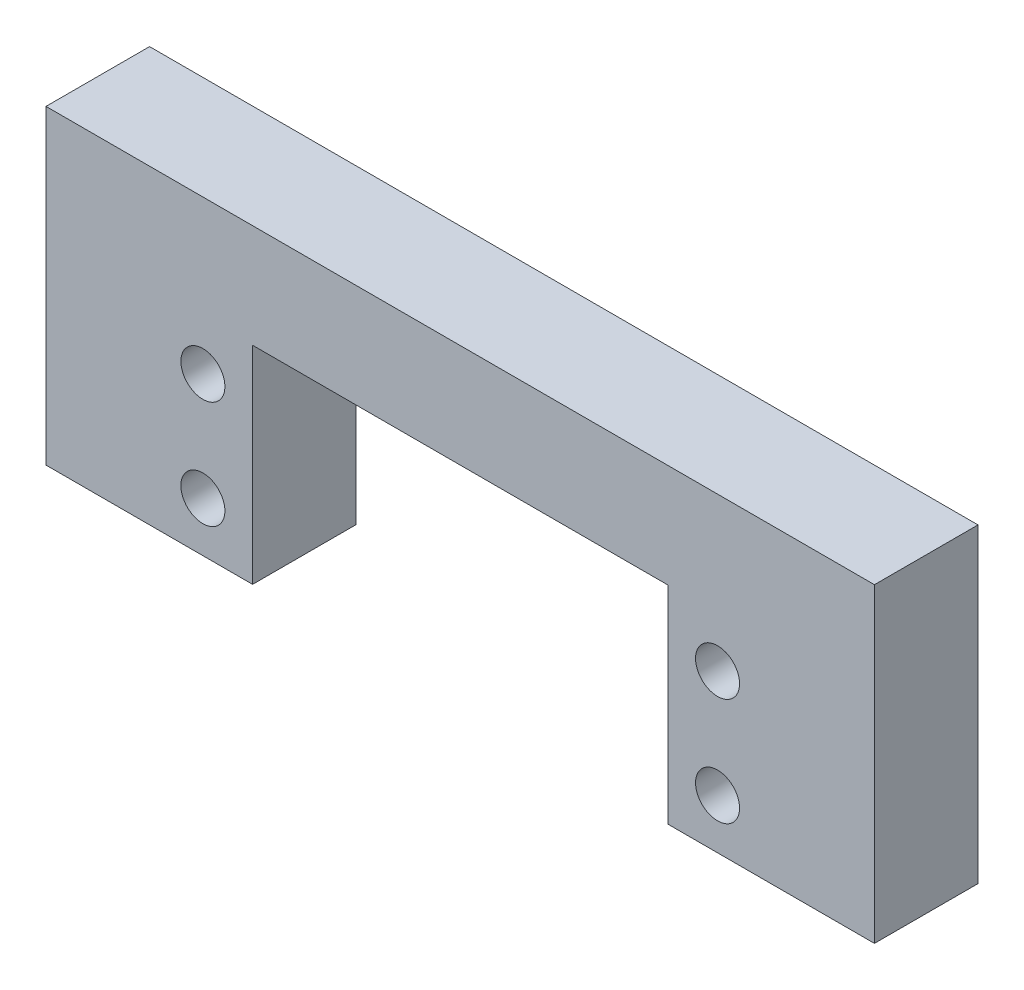
ISO-10303-21;
HEADER;
FILE_DESCRIPTION(('STEP AP214'),'2;1');
FILE_NAME('part.step','',(''),(''),'','','');
FILE_SCHEMA(('AUTOMOTIVE_DESIGN { 1 0 10303 214 1 1 1 1 }'));
ENDSEC;
DATA;
#1=APPLICATION_CONTEXT('core data for automotive mechanical design processes');
#2=APPLICATION_PROTOCOL_DEFINITION('international standard','automotive_design',2000,#1);
#3=PRODUCT_CONTEXT('',#1,'mechanical');
#4=PRODUCT('Part','Part','',(#3));
#5=PRODUCT_RELATED_PRODUCT_CATEGORY('part','',(#4));
#6=PRODUCT_DEFINITION_FORMATION('','',#4);
#7=PRODUCT_DEFINITION_CONTEXT('part definition',#1,'design');
#8=PRODUCT_DEFINITION('design','',#6,#7);
#9=PRODUCT_DEFINITION_SHAPE('','',#8);
#10=(LENGTH_UNIT() NAMED_UNIT(*) SI_UNIT(.MILLI.,.METRE.));
#11=(NAMED_UNIT(*) PLANE_ANGLE_UNIT() SI_UNIT($,.RADIAN.));
#12=(NAMED_UNIT(*) SI_UNIT($,.STERADIAN.) SOLID_ANGLE_UNIT());
#13=UNCERTAINTY_MEASURE_WITH_UNIT(LENGTH_MEASURE(1.E-05),#10,'distance_accuracy_value','');
#14=(GEOMETRIC_REPRESENTATION_CONTEXT(3) GLOBAL_UNCERTAINTY_ASSIGNED_CONTEXT((#13)) GLOBAL_UNIT_ASSIGNED_CONTEXT((#10,
#11,#12)) REPRESENTATION_CONTEXT('',''));
#15=CARTESIAN_POINT('',(0.,0.,0.));
#16=DIRECTION('',(0.,0.,1.));
#17=DIRECTION('',(1.,0.,0.));
#18=AXIS2_PLACEMENT_3D('',#15,#16,#17);
#19=CARTESIAN_POINT('',(0.,0.,10.));
#20=DIRECTION('',(1.,0.,0.));
#21=DIRECTION('',(0.,0.,-1.));
#22=AXIS2_PLACEMENT_3D('',#19,#20,#21);
#23=PLANE('',#22);
#24=DIRECTION('',(0.,-1.,0.));
#25=VECTOR('',#24,1.);
#26=CARTESIAN_POINT('',(0.,0.,0.));
#27=LINE('',#26,#25);
#28=CARTESIAN_POINT('',(0.,30.,0.));
#29=VERTEX_POINT('',#28);
#30=CARTESIAN_POINT('',(0.,0.,0.));
#31=VERTEX_POINT('',#30);
#32=EDGE_CURVE('E129',#29,#31,#27,.T.);
#33=ORIENTED_EDGE('',*,*,#32,.T.);
#34=DIRECTION('',(0.,0.,-1.));
#35=VECTOR('',#34,1.);
#36=CARTESIAN_POINT('',(0.,0.,10.));
#37=LINE('',#36,#35);
#38=CARTESIAN_POINT('',(0.,0.,10.));
#39=VERTEX_POINT('',#38);
#40=EDGE_CURVE('E11',#39,#31,#37,.T.);
#41=ORIENTED_EDGE('',*,*,#40,.F.);
#42=DIRECTION('',(0.,-1.,0.));
#43=VECTOR('',#42,1.);
#44=CARTESIAN_POINT('',(0.,0.,10.));
#45=LINE('',#44,#43);
#46=CARTESIAN_POINT('',(0.,30.,10.));
#47=VERTEX_POINT('',#46);
#48=EDGE_CURVE('E144',#47,#39,#45,.T.);
#49=ORIENTED_EDGE('',*,*,#48,.F.);
#50=DIRECTION('',(0.,0.,-1.));
#51=VECTOR('',#50,1.);
#52=CARTESIAN_POINT('',(0.,30.,10.));
#53=LINE('',#52,#51);
#54=EDGE_CURVE('E125',#47,#29,#53,.T.);
#55=ORIENTED_EDGE('',*,*,#54,.T.);
#56=EDGE_LOOP('',(#33,#41,#49,#55));
#57=FACE_BOUND('',#56,.T.);
#58=ADVANCED_FACE('F33',(#57),#23,.F.);
#59=CARTESIAN_POINT('',(0.,0.,10.));
#60=DIRECTION('',(0.,1.,0.));
#61=DIRECTION('',(0.,0.,1.));
#62=AXIS2_PLACEMENT_3D('',#59,#60,#61);
#63=PLANE('',#62);
#64=CARTESIAN_POINT('',(5.,0.,5.));
#65=DIRECTION('',(0.,-1.,0.));
#66=DIRECTION('',(0.,0.,-1.));
#67=AXIS2_PLACEMENT_3D('',#64,#65,#66);
#68=CIRCLE('',#67,2.);
#69=CARTESIAN_POINT('',(5.,0.,3.));
#70=VERTEX_POINT('',#69);
#71=EDGE_CURVE('E177',#70,#70,#68,.T.);
#72=ORIENTED_EDGE('',*,*,#71,.F.);
#73=EDGE_LOOP('',(#72));
#74=FACE_BOUND('',#73,.T.);
#75=DIRECTION('',(1.,0.,0.));
#76=VECTOR('',#75,1.);
#77=CARTESIAN_POINT('',(0.,0.,0.));
#78=LINE('',#77,#76);
#79=CARTESIAN_POINT('',(19.95,0.,0.));
#80=VERTEX_POINT('',#79);
#81=EDGE_CURVE('E132',#31,#80,#78,.T.);
#82=ORIENTED_EDGE('',*,*,#81,.T.);
#83=DIRECTION('',(0.,0.,-1.));
#84=VECTOR('',#83,1.);
#85=CARTESIAN_POINT('',(19.95,0.,10.));
#86=LINE('',#85,#84);
#87=CARTESIAN_POINT('',(19.95,0.,10.));
#88=VERTEX_POINT('',#87);
#89=EDGE_CURVE('E41',#88,#80,#86,.T.);
#90=ORIENTED_EDGE('',*,*,#89,.F.);
#91=DIRECTION('',(1.,0.,0.));
#92=VECTOR('',#91,1.);
#93=CARTESIAN_POINT('',(0.,0.,10.));
#94=LINE('',#93,#92);
#95=EDGE_CURVE('E92',#39,#88,#94,.T.);
#96=ORIENTED_EDGE('',*,*,#95,.F.);
#97=ORIENTED_EDGE('',*,*,#40,.T.);
#98=EDGE_LOOP('',(#82,#90,#96,#97));
#99=FACE_BOUND('',#98,.T.);
#100=ADVANCED_FACE('F249',(#74,#99),#63,.F.);
#101=CARTESIAN_POINT('',(19.95,0.,10.));
#102=DIRECTION('',(-1.,0.,0.));
#103=DIRECTION('',(0.,0.,1.));
#104=AXIS2_PLACEMENT_3D('',#101,#102,#103);
#105=PLANE('',#104);
#106=DIRECTION('',(0.,1.,0.));
#107=VECTOR('',#106,1.);
#108=CARTESIAN_POINT('',(19.95,0.,0.));
#109=LINE('',#108,#107);
#110=CARTESIAN_POINT('',(19.95,20.,0.));
#111=VERTEX_POINT('',#110);
#112=EDGE_CURVE('E135',#80,#111,#109,.T.);
#113=ORIENTED_EDGE('',*,*,#112,.T.);
#114=DIRECTION('',(0.,0.,-1.));
#115=VECTOR('',#114,1.);
#116=CARTESIAN_POINT('',(19.95,20.,10.));
#117=LINE('',#116,#115);
#118=CARTESIAN_POINT('',(19.95,20.,10.));
#119=VERTEX_POINT('',#118);
#120=EDGE_CURVE('E151',#119,#111,#117,.T.);
#121=ORIENTED_EDGE('',*,*,#120,.F.);
#122=DIRECTION('',(0.,1.,0.));
#123=VECTOR('',#122,1.);
#124=CARTESIAN_POINT('',(19.95,0.,10.));
#125=LINE('',#124,#123);
#126=EDGE_CURVE('E159',#88,#119,#125,.T.);
#127=ORIENTED_EDGE('',*,*,#126,.F.);
#128=ORIENTED_EDGE('',*,*,#89,.T.);
#129=EDGE_LOOP('',(#113,#121,#127,#128));
#130=FACE_BOUND('',#129,.T.);
#131=ADVANCED_FACE('F157',(#130),#105,.F.);
#132=CARTESIAN_POINT('',(19.95,20.,10.));
#133=DIRECTION('',(0.,1.,0.));
#134=DIRECTION('',(0.,0.,1.));
#135=AXIS2_PLACEMENT_3D('',#132,#133,#134);
#136=PLANE('',#135);
#137=DIRECTION('',(1.,0.,0.));
#138=VECTOR('',#137,1.);
#139=CARTESIAN_POINT('',(19.95,20.,0.));
#140=LINE('',#139,#138);
#141=CARTESIAN_POINT('',(60.05,20.,0.));
#142=VERTEX_POINT('',#141);
#143=EDGE_CURVE('E137',#111,#142,#140,.T.);
#144=ORIENTED_EDGE('',*,*,#143,.T.);
#145=DIRECTION('',(0.,0.,-1.));
#146=VECTOR('',#145,1.);
#147=CARTESIAN_POINT('',(60.05,20.,10.));
#148=LINE('',#147,#146);
#149=CARTESIAN_POINT('',(60.05,20.,10.));
#150=VERTEX_POINT('',#149);
#151=EDGE_CURVE('E148',#150,#142,#148,.T.);
#152=ORIENTED_EDGE('',*,*,#151,.F.);
#153=DIRECTION('',(1.,0.,0.));
#154=VECTOR('',#153,1.);
#155=CARTESIAN_POINT('',(19.95,20.,10.));
#156=LINE('',#155,#154);
#157=EDGE_CURVE('E171',#119,#150,#156,.T.);
#158=ORIENTED_EDGE('',*,*,#157,.F.);
#159=ORIENTED_EDGE('',*,*,#120,.T.);
#160=EDGE_LOOP('',(#144,#152,#158,#159));
#161=FACE_BOUND('',#160,.T.);
#162=ADVANCED_FACE('F167',(#161),#136,.F.);
#163=CARTESIAN_POINT('',(60.05,0.,10.));
#164=DIRECTION('',(1.,0.,0.));
#165=DIRECTION('',(0.,0.,-1.));
#166=AXIS2_PLACEMENT_3D('',#163,#164,#165);
#167=PLANE('',#166);
#168=DIRECTION('',(0.,-1.,0.));
#169=VECTOR('',#168,1.);
#170=CARTESIAN_POINT('',(60.05,0.,0.));
#171=LINE('',#170,#169);
#172=CARTESIAN_POINT('',(60.05,0.,0.));
#173=VERTEX_POINT('',#172);
#174=EDGE_CURVE('E139',#142,#173,#171,.T.);
#175=ORIENTED_EDGE('',*,*,#174,.T.);
#176=DIRECTION('',(0.,0.,-1.));
#177=VECTOR('',#176,1.);
#178=CARTESIAN_POINT('',(60.05,0.,10.));
#179=LINE('',#178,#177);
#180=CARTESIAN_POINT('',(60.05,0.,10.));
#181=VERTEX_POINT('',#180);
#182=EDGE_CURVE('E120',#181,#173,#179,.T.);
#183=ORIENTED_EDGE('',*,*,#182,.F.);
#184=DIRECTION('',(0.,-1.,0.));
#185=VECTOR('',#184,1.);
#186=CARTESIAN_POINT('',(60.05,0.,10.));
#187=LINE('',#186,#185);
#188=EDGE_CURVE('E111',#150,#181,#187,.T.);
#189=ORIENTED_EDGE('',*,*,#188,.F.);
#190=ORIENTED_EDGE('',*,*,#151,.T.);
#191=EDGE_LOOP('',(#175,#183,#189,#190));
#192=FACE_BOUND('',#191,.T.);
#193=ADVANCED_FACE('F170',(#192),#167,.F.);
#194=CARTESIAN_POINT('',(60.05,0.,10.));
#195=DIRECTION('',(0.,1.,0.));
#196=DIRECTION('',(0.,0.,1.));
#197=AXIS2_PLACEMENT_3D('',#194,#195,#196);
#198=PLANE('',#197);
#199=CARTESIAN_POINT('',(75.,0.,5.));
#200=DIRECTION('',(0.,-1.,0.));
#201=DIRECTION('',(0.,0.,-1.));
#202=AXIS2_PLACEMENT_3D('',#199,#200,#201);
#203=CIRCLE('',#202,2.);
#204=CARTESIAN_POINT('',(75.,0.,3.));
#205=VERTEX_POINT('',#204);
#206=EDGE_CURVE('E183',#205,#205,#203,.T.);
#207=ORIENTED_EDGE('',*,*,#206,.F.);
#208=EDGE_LOOP('',(#207));
#209=FACE_BOUND('',#208,.T.);
#210=DIRECTION('',(1.,0.,0.));
#211=VECTOR('',#210,1.);
#212=CARTESIAN_POINT('',(60.05,0.,0.));
#213=LINE('',#212,#211);
#214=CARTESIAN_POINT('',(80.,0.,0.));
#215=VERTEX_POINT('',#214);
#216=EDGE_CURVE('E119',#173,#215,#213,.T.);
#217=ORIENTED_EDGE('',*,*,#216,.T.);
#218=DIRECTION('',(0.,0.,-1.));
#219=VECTOR('',#218,1.);
#220=CARTESIAN_POINT('',(80.,0.,10.));
#221=LINE('',#220,#219);
#222=CARTESIAN_POINT('',(80.,0.,10.));
#223=VERTEX_POINT('',#222);
#224=EDGE_CURVE('E116',#223,#215,#221,.T.);
#225=ORIENTED_EDGE('',*,*,#224,.F.);
#226=DIRECTION('',(1.,0.,0.));
#227=VECTOR('',#226,1.);
#228=CARTESIAN_POINT('',(60.05,0.,10.));
#229=LINE('',#228,#227);
#230=EDGE_CURVE('E105',#181,#223,#229,.T.);
#231=ORIENTED_EDGE('',*,*,#230,.F.);
#232=ORIENTED_EDGE('',*,*,#182,.T.);
#233=EDGE_LOOP('',(#217,#225,#231,#232));
#234=FACE_BOUND('',#233,.T.);
#235=ADVANCED_FACE('F117',(#209,#234),#198,.F.);
#236=CARTESIAN_POINT('',(80.,0.,10.));
#237=DIRECTION('',(-1.,0.,0.));
#238=DIRECTION('',(0.,0.,1.));
#239=AXIS2_PLACEMENT_3D('',#236,#237,#238);
#240=PLANE('',#239);
#241=DIRECTION('',(0.,1.,0.));
#242=VECTOR('',#241,1.);
#243=CARTESIAN_POINT('',(80.,0.,0.));
#244=LINE('',#243,#242);
#245=CARTESIAN_POINT('',(80.,30.,0.));
#246=VERTEX_POINT('',#245);
#247=EDGE_CURVE('E78',#215,#246,#244,.T.);
#248=ORIENTED_EDGE('',*,*,#247,.T.);
#249=DIRECTION('',(0.,0.,-1.));
#250=VECTOR('',#249,1.);
#251=CARTESIAN_POINT('',(80.,30.,10.));
#252=LINE('',#251,#250);
#253=CARTESIAN_POINT('',(80.,30.,10.));
#254=VERTEX_POINT('',#253);
#255=EDGE_CURVE('E121',#254,#246,#252,.T.);
#256=ORIENTED_EDGE('',*,*,#255,.F.);
#257=DIRECTION('',(0.,1.,0.));
#258=VECTOR('',#257,1.);
#259=CARTESIAN_POINT('',(80.,0.,10.));
#260=LINE('',#259,#258);
#261=EDGE_CURVE('E109',#223,#254,#260,.T.);
#262=ORIENTED_EDGE('',*,*,#261,.F.);
#263=ORIENTED_EDGE('',*,*,#224,.T.);
#264=EDGE_LOOP('',(#248,#256,#262,#263));
#265=FACE_BOUND('',#264,.T.);
#266=ADVANCED_FACE('F123',(#265),#240,.F.);
#267=CARTESIAN_POINT('',(0.,30.,10.));
#268=DIRECTION('',(0.,-1.,0.));
#269=DIRECTION('',(0.,0.,-1.));
#270=AXIS2_PLACEMENT_3D('',#267,#268,#269);
#271=PLANE('',#270);
#272=DIRECTION('',(-1.,0.,0.));
#273=VECTOR('',#272,1.);
#274=CARTESIAN_POINT('',(0.,30.,0.));
#275=LINE('',#274,#273);
#276=EDGE_CURVE('E84',#246,#29,#275,.T.);
#277=ORIENTED_EDGE('',*,*,#276,.T.);
#278=ORIENTED_EDGE('',*,*,#54,.F.);
#279=DIRECTION('',(-1.,0.,0.));
#280=VECTOR('',#279,1.);
#281=CARTESIAN_POINT('',(0.,30.,10.));
#282=LINE('',#281,#280);
#283=EDGE_CURVE('E49',#254,#47,#282,.T.);
#284=ORIENTED_EDGE('',*,*,#283,.F.);
#285=ORIENTED_EDGE('',*,*,#255,.T.);
#286=EDGE_LOOP('',(#277,#278,#284,#285));
#287=FACE_BOUND('',#286,.T.);
#288=ADVANCED_FACE('F224',(#287),#271,.F.);
#289=CARTESIAN_POINT('',(0.,30.,10.));
#290=DIRECTION('',(0.,0.,-1.));
#291=DIRECTION('',(-1.,0.,0.));
#292=AXIS2_PLACEMENT_3D('',#289,#290,#291);
#293=PLANE('',#292);
#294=CARTESIAN_POINT('',(64.85,4.8,10.));
#295=DIRECTION('',(0.,0.,1.));
#296=DIRECTION('',(-1.,0.,0.));
#297=AXIS2_PLACEMENT_3D('',#294,#295,#296);
#298=CIRCLE('',#297,2.125);
#299=CARTESIAN_POINT('',(62.725,4.8,10.));
#300=VERTEX_POINT('',#299);
#301=EDGE_CURVE('E207',#300,#300,#298,.T.);
#302=ORIENTED_EDGE('',*,*,#301,.F.);
#303=EDGE_LOOP('',(#302));
#304=FACE_BOUND('',#303,.T.);
#305=CARTESIAN_POINT('',(64.85,15.2,10.));
#306=DIRECTION('',(0.,0.,1.));
#307=DIRECTION('',(-1.,0.,0.));
#308=AXIS2_PLACEMENT_3D('',#305,#306,#307);
#309=CIRCLE('',#308,2.12499999999999);
#310=CARTESIAN_POINT('',(62.725,15.2,10.));
#311=VERTEX_POINT('',#310);
#312=EDGE_CURVE('E201',#311,#311,#309,.T.);
#313=ORIENTED_EDGE('',*,*,#312,.F.);
#314=EDGE_LOOP('',(#313));
#315=FACE_BOUND('',#314,.T.);
#316=CARTESIAN_POINT('',(15.15,15.2,10.));
#317=DIRECTION('',(0.,0.,1.));
#318=DIRECTION('',(1.,0.,0.));
#319=AXIS2_PLACEMENT_3D('',#316,#317,#318);
#320=CIRCLE('',#319,2.125);
#321=CARTESIAN_POINT('',(17.275,15.2,10.));
#322=VERTEX_POINT('',#321);
#323=EDGE_CURVE('E195',#322,#322,#320,.T.);
#324=ORIENTED_EDGE('',*,*,#323,.F.);
#325=EDGE_LOOP('',(#324));
#326=FACE_BOUND('',#325,.T.);
#327=CARTESIAN_POINT('',(15.15,4.8,10.));
#328=DIRECTION('',(0.,0.,1.));
#329=DIRECTION('',(1.,0.,0.));
#330=AXIS2_PLACEMENT_3D('',#327,#328,#329);
#331=CIRCLE('',#330,2.125);
#332=CARTESIAN_POINT('',(17.275,4.8,10.));
#333=VERTEX_POINT('',#332);
#334=EDGE_CURVE('E189',#333,#333,#331,.T.);
#335=ORIENTED_EDGE('',*,*,#334,.F.);
#336=EDGE_LOOP('',(#335));
#337=FACE_BOUND('',#336,.T.);
#338=ORIENTED_EDGE('',*,*,#48,.T.);
#339=ORIENTED_EDGE('',*,*,#95,.T.);
#340=ORIENTED_EDGE('',*,*,#126,.T.);
#341=ORIENTED_EDGE('',*,*,#157,.T.);
#342=ORIENTED_EDGE('',*,*,#188,.T.);
#343=ORIENTED_EDGE('',*,*,#230,.T.);
#344=ORIENTED_EDGE('',*,*,#261,.T.);
#345=ORIENTED_EDGE('',*,*,#283,.T.);
#346=EDGE_LOOP('',(#338,#339,#340,#341,#342,#343,#344,#345));
#347=FACE_BOUND('',#346,.T.);
#348=ADVANCED_FACE('F107',(#304,#315,#326,#337,#347),#293,.F.);
#349=CARTESIAN_POINT('',(0.,30.,0.));
#350=DIRECTION('',(0.,0.,-1.));
#351=DIRECTION('',(-1.,0.,0.));
#352=AXIS2_PLACEMENT_3D('',#349,#350,#351);
#353=PLANE('',#352);
#354=CARTESIAN_POINT('',(64.85,4.8,0.));
#355=DIRECTION('',(0.,0.,1.));
#356=DIRECTION('',(-1.,0.,0.));
#357=AXIS2_PLACEMENT_3D('',#354,#355,#356);
#358=CIRCLE('',#357,2.125);
#359=CARTESIAN_POINT('',(62.725,4.8,0.));
#360=VERTEX_POINT('',#359);
#361=EDGE_CURVE('E204',#360,#360,#358,.T.);
#362=ORIENTED_EDGE('',*,*,#361,.T.);
#363=EDGE_LOOP('',(#362));
#364=FACE_BOUND('',#363,.T.);
#365=CARTESIAN_POINT('',(64.85,15.2,0.));
#366=DIRECTION('',(0.,0.,1.));
#367=DIRECTION('',(-1.,0.,0.));
#368=AXIS2_PLACEMENT_3D('',#365,#366,#367);
#369=CIRCLE('',#368,2.12499999999999);
#370=CARTESIAN_POINT('',(62.725,15.2,0.));
#371=VERTEX_POINT('',#370);
#372=EDGE_CURVE('E198',#371,#371,#369,.T.);
#373=ORIENTED_EDGE('',*,*,#372,.T.);
#374=EDGE_LOOP('',(#373));
#375=FACE_BOUND('',#374,.T.);
#376=CARTESIAN_POINT('',(15.15,15.2,0.));
#377=DIRECTION('',(0.,0.,1.));
#378=DIRECTION('',(1.,0.,0.));
#379=AXIS2_PLACEMENT_3D('',#376,#377,#378);
#380=CIRCLE('',#379,2.125);
#381=CARTESIAN_POINT('',(17.275,15.2,0.));
#382=VERTEX_POINT('',#381);
#383=EDGE_CURVE('E192',#382,#382,#380,.T.);
#384=ORIENTED_EDGE('',*,*,#383,.T.);
#385=EDGE_LOOP('',(#384));
#386=FACE_BOUND('',#385,.T.);
#387=CARTESIAN_POINT('',(15.15,4.8,0.));
#388=DIRECTION('',(0.,0.,1.));
#389=DIRECTION('',(1.,0.,0.));
#390=AXIS2_PLACEMENT_3D('',#387,#388,#389);
#391=CIRCLE('',#390,2.125);
#392=CARTESIAN_POINT('',(17.275,4.8,0.));
#393=VERTEX_POINT('',#392);
#394=EDGE_CURVE('E186',#393,#393,#391,.T.);
#395=ORIENTED_EDGE('',*,*,#394,.T.);
#396=EDGE_LOOP('',(#395));
#397=FACE_BOUND('',#396,.T.);
#398=ORIENTED_EDGE('',*,*,#32,.F.);
#399=ORIENTED_EDGE('',*,*,#276,.F.);
#400=ORIENTED_EDGE('',*,*,#247,.F.);
#401=ORIENTED_EDGE('',*,*,#216,.F.);
#402=ORIENTED_EDGE('',*,*,#174,.F.);
#403=ORIENTED_EDGE('',*,*,#143,.F.);
#404=ORIENTED_EDGE('',*,*,#112,.F.);
#405=ORIENTED_EDGE('',*,*,#81,.F.);
#406=EDGE_LOOP('',(#398,#399,#400,#401,#402,#403,#404,#405));
#407=FACE_BOUND('',#406,.T.);
#408=ADVANCED_FACE('F163',(#364,#375,#386,#397,#407),#353,.T.);
#409=CARTESIAN_POINT('',(5.,15.,5.));
#410=DIRECTION('',(0.,-1.,0.));
#411=DIRECTION('',(0.,0.,-1.));
#412=AXIS2_PLACEMENT_3D('',#409,#410,#411);
#413=CYLINDRICAL_SURFACE('',#412,2.);
#414=CARTESIAN_POINT('',(5.,15.,5.));
#415=DIRECTION('',(0.,-1.,0.));
#416=DIRECTION('',(0.,0.,-1.));
#417=AXIS2_PLACEMENT_3D('',#414,#415,#416);
#418=CIRCLE('',#417,2.);
#419=CARTESIAN_POINT('',(5.,15.,3.));
#420=VERTEX_POINT('',#419);
#421=EDGE_CURVE('E133',#420,#420,#418,.T.);
#422=ORIENTED_EDGE('',*,*,#421,.F.);
#423=EDGE_LOOP('',(#422));
#424=FACE_BOUND('',#423,.T.);
#425=ORIENTED_EDGE('',*,*,#71,.T.);
#426=EDGE_LOOP('',(#425));
#427=FACE_BOUND('',#426,.T.);
#428=ADVANCED_FACE('F330',(#424,#427),#413,.F.);
#429=CARTESIAN_POINT('',(5.,15.,5.));
#430=DIRECTION('',(0.,-1.,0.));
#431=DIRECTION('',(0.,0.,-1.));
#432=AXIS2_PLACEMENT_3D('',#429,#430,#431);
#433=PLANE('',#432);
#434=ORIENTED_EDGE('',*,*,#421,.T.);
#435=EDGE_LOOP('',(#434));
#436=FACE_BOUND('',#435,.T.);
#437=ADVANCED_FACE('F336',(#436),#433,.T.);
#438=CARTESIAN_POINT('',(75.,15.,5.));
#439=DIRECTION('',(0.,-1.,0.));
#440=DIRECTION('',(0.,0.,-1.));
#441=AXIS2_PLACEMENT_3D('',#438,#439,#440);
#442=CYLINDRICAL_SURFACE('',#441,2.);
#443=CARTESIAN_POINT('',(75.,15.,5.));
#444=DIRECTION('',(0.,-1.,0.));
#445=DIRECTION('',(0.,0.,-1.));
#446=AXIS2_PLACEMENT_3D('',#443,#444,#445);
#447=CIRCLE('',#446,2.);
#448=CARTESIAN_POINT('',(75.,15.,3.));
#449=VERTEX_POINT('',#448);
#450=EDGE_CURVE('E180',#449,#449,#447,.T.);
#451=ORIENTED_EDGE('',*,*,#450,.F.);
#452=EDGE_LOOP('',(#451));
#453=FACE_BOUND('',#452,.T.);
#454=ORIENTED_EDGE('',*,*,#206,.T.);
#455=EDGE_LOOP('',(#454));
#456=FACE_BOUND('',#455,.T.);
#457=ADVANCED_FACE('F244',(#453,#456),#442,.F.);
#458=CARTESIAN_POINT('',(75.,15.,5.));
#459=DIRECTION('',(0.,-1.,0.));
#460=DIRECTION('',(0.,0.,-1.));
#461=AXIS2_PLACEMENT_3D('',#458,#459,#460);
#462=PLANE('',#461);
#463=ORIENTED_EDGE('',*,*,#450,.T.);
#464=EDGE_LOOP('',(#463));
#465=FACE_BOUND('',#464,.T.);
#466=ADVANCED_FACE('F235',(#465),#462,.T.);
#467=CARTESIAN_POINT('',(15.15,4.8,0.));
#468=DIRECTION('',(0.,0.,1.));
#469=DIRECTION('',(1.,0.,0.));
#470=AXIS2_PLACEMENT_3D('',#467,#468,#469);
#471=CYLINDRICAL_SURFACE('',#470,2.125);
#472=ORIENTED_EDGE('',*,*,#394,.F.);
#473=EDGE_LOOP('',(#472));
#474=FACE_BOUND('',#473,.T.);
#475=ORIENTED_EDGE('',*,*,#334,.T.);
#476=EDGE_LOOP('',(#475));
#477=FACE_BOUND('',#476,.T.);
#478=ADVANCED_FACE('F232',(#474,#477),#471,.F.);
#479=CARTESIAN_POINT('',(15.15,15.2,0.));
#480=DIRECTION('',(0.,0.,1.));
#481=DIRECTION('',(1.,0.,0.));
#482=AXIS2_PLACEMENT_3D('',#479,#480,#481);
#483=CYLINDRICAL_SURFACE('',#482,2.125);
#484=ORIENTED_EDGE('',*,*,#383,.F.);
#485=EDGE_LOOP('',(#484));
#486=FACE_BOUND('',#485,.T.);
#487=ORIENTED_EDGE('',*,*,#323,.T.);
#488=EDGE_LOOP('',(#487));
#489=FACE_BOUND('',#488,.T.);
#490=ADVANCED_FACE('F234',(#486,#489),#483,.F.);
#491=CARTESIAN_POINT('',(64.85,15.2,0.));
#492=DIRECTION('',(0.,0.,1.));
#493=DIRECTION('',(1.,0.,0.));
#494=AXIS2_PLACEMENT_3D('',#491,#492,#493);
#495=CYLINDRICAL_SURFACE('',#494,2.12499999999999);
#496=ORIENTED_EDGE('',*,*,#372,.F.);
#497=EDGE_LOOP('',(#496));
#498=FACE_BOUND('',#497,.T.);
#499=ORIENTED_EDGE('',*,*,#312,.T.);
#500=EDGE_LOOP('',(#499));
#501=FACE_BOUND('',#500,.T.);
#502=ADVANCED_FACE('F218',(#498,#501),#495,.F.);
#503=CARTESIAN_POINT('',(64.85,4.8,0.));
#504=DIRECTION('',(0.,0.,1.));
#505=DIRECTION('',(1.,0.,0.));
#506=AXIS2_PLACEMENT_3D('',#503,#504,#505);
#507=CYLINDRICAL_SURFACE('',#506,2.125);
#508=ORIENTED_EDGE('',*,*,#361,.F.);
#509=EDGE_LOOP('',(#508));
#510=FACE_BOUND('',#509,.T.);
#511=ORIENTED_EDGE('',*,*,#301,.T.);
#512=EDGE_LOOP('',(#511));
#513=FACE_BOUND('',#512,.T.);
#514=ADVANCED_FACE('F215',(#510,#513),#507,.F.);
#515=CLOSED_SHELL('',(#58,#100,#131,#162,#193,#235,#266,#288,#348,#408,#428,#437,#457,#466,#478,
#490,#502,#514));
#516=MANIFOLD_SOLID_BREP('B2',#515);
#517=ADVANCED_BREP_SHAPE_REPRESENTATION('',(#18,#516),#14);
#518=SHAPE_DEFINITION_REPRESENTATION(#9,#517);
ENDSEC;
END-ISO-10303-21;
